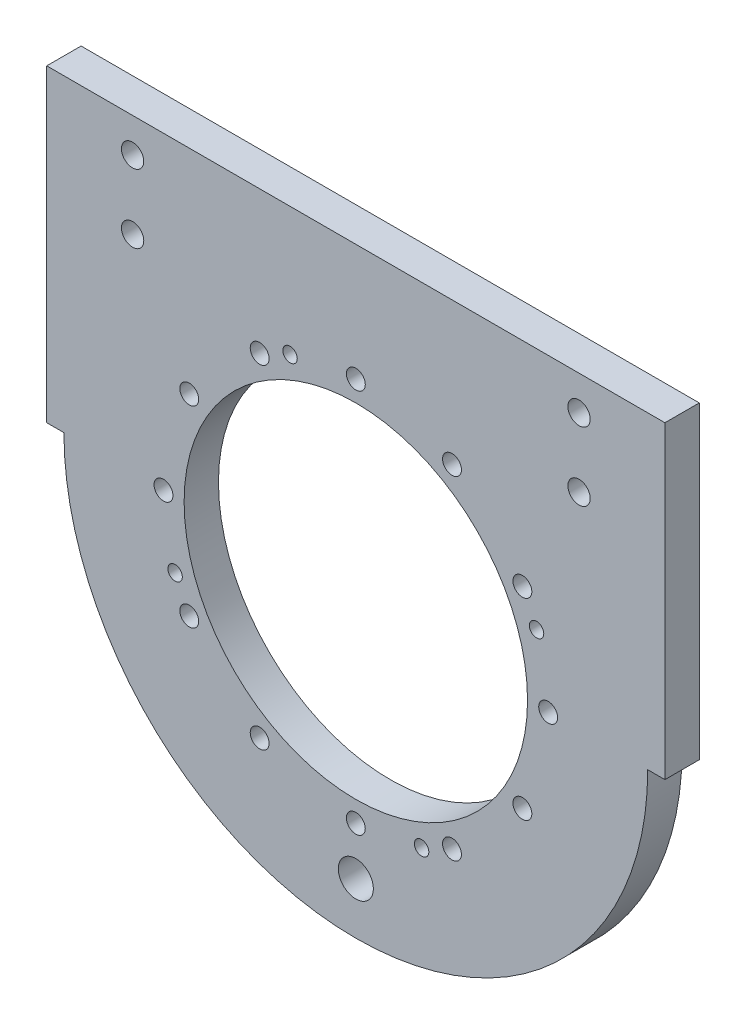
ISO-10303-21;
HEADER;
FILE_DESCRIPTION(('STEP AP214'),'2;1');
FILE_NAME('part.step','',(''),(''),'','','');
FILE_SCHEMA(('AUTOMOTIVE_DESIGN { 1 0 10303 214 1 1 1 1 }'));
ENDSEC;
DATA;
#1=APPLICATION_CONTEXT('core data for automotive mechanical design processes');
#2=APPLICATION_PROTOCOL_DEFINITION('international standard','automotive_design',2000,#1);
#3=PRODUCT_CONTEXT('',#1,'mechanical');
#4=PRODUCT('Part','Part','',(#3));
#5=PRODUCT_RELATED_PRODUCT_CATEGORY('part','',(#4));
#6=PRODUCT_DEFINITION_FORMATION('','',#4);
#7=PRODUCT_DEFINITION_CONTEXT('part definition',#1,'design');
#8=PRODUCT_DEFINITION('design','',#6,#7);
#9=PRODUCT_DEFINITION_SHAPE('','',#8);
#10=(LENGTH_UNIT() NAMED_UNIT(*) SI_UNIT(.MILLI.,.METRE.));
#11=(NAMED_UNIT(*) PLANE_ANGLE_UNIT() SI_UNIT($,.RADIAN.));
#12=(NAMED_UNIT(*) SI_UNIT($,.STERADIAN.) SOLID_ANGLE_UNIT());
#13=UNCERTAINTY_MEASURE_WITH_UNIT(LENGTH_MEASURE(1.E-05),#10,'distance_accuracy_value','');
#14=(GEOMETRIC_REPRESENTATION_CONTEXT(3) GLOBAL_UNCERTAINTY_ASSIGNED_CONTEXT((#13)) GLOBAL_UNIT_ASSIGNED_CONTEXT((#10,
#11,#12)) REPRESENTATION_CONTEXT('',''));
#15=CARTESIAN_POINT('',(0.,0.,0.));
#16=DIRECTION('',(0.,0.,1.));
#17=DIRECTION('',(1.,0.,0.));
#18=AXIS2_PLACEMENT_3D('',#15,#16,#17);
#19=CARTESIAN_POINT('',(0.,0.,10.));
#20=DIRECTION('',(0.,0.,-1.));
#21=DIRECTION('',(-1.,0.,0.));
#22=AXIS2_PLACEMENT_3D('',#19,#20,#21);
#23=CYLINDRICAL_SURFACE('',#22,85.);
#24=DIRECTION('',(0.,0.,-1.));
#25=VECTOR('',#24,1.);
#26=CARTESIAN_POINT('',(85.,0.,10.));
#27=LINE('',#26,#25);
#28=CARTESIAN_POINT('',(85.,0.,10.));
#29=VERTEX_POINT('',#28);
#30=CARTESIAN_POINT('',(85.,0.,0.));
#31=VERTEX_POINT('',#30);
#32=EDGE_CURVE('E65',#29,#31,#27,.T.);
#33=ORIENTED_EDGE('',*,*,#32,.F.);
#34=CARTESIAN_POINT('',(0.,0.,10.));
#35=DIRECTION('',(0.,0.,1.));
#36=DIRECTION('',(1.,0.,0.));
#37=AXIS2_PLACEMENT_3D('',#34,#35,#36);
#38=CIRCLE('',#37,85.);
#39=CARTESIAN_POINT('',(-85.,0.,10.));
#40=VERTEX_POINT('',#39);
#41=EDGE_CURVE('E11',#40,#29,#38,.T.);
#42=ORIENTED_EDGE('',*,*,#41,.F.);
#43=DIRECTION('',(0.,0.,-1.));
#44=VECTOR('',#43,1.);
#45=CARTESIAN_POINT('',(-85.,0.,10.));
#46=LINE('',#45,#44);
#47=CARTESIAN_POINT('',(-85.,0.,0.));
#48=VERTEX_POINT('',#47);
#49=EDGE_CURVE('E104',#48,#40,#46,.F.);
#50=ORIENTED_EDGE('',*,*,#49,.F.);
#51=CARTESIAN_POINT('',(0.,0.,0.));
#52=DIRECTION('',(0.,0.,1.));
#53=DIRECTION('',(1.,0.,0.));
#54=AXIS2_PLACEMENT_3D('',#51,#52,#53);
#55=CIRCLE('',#54,85.);
#56=EDGE_CURVE('E50',#48,#31,#55,.T.);
#57=ORIENTED_EDGE('',*,*,#56,.T.);
#58=EDGE_LOOP('',(#33,#42,#50,#57));
#59=FACE_BOUND('',#58,.T.);
#60=ADVANCED_FACE('F47',(#59),#23,.T.);
#61=CARTESIAN_POINT('',(0.,0.,10.));
#62=DIRECTION('',(0.,0.,1.));
#63=DIRECTION('',(1.,0.,0.));
#64=AXIS2_PLACEMENT_3D('',#61,#62,#63);
#65=PLANE('',#64);
#66=CARTESIAN_POINT('',(-28.,-48.4974226119286,10.));
#67=DIRECTION('',(0.,0.,1.));
#68=DIRECTION('',(1.,0.,0.));
#69=AXIS2_PLACEMENT_3D('',#66,#67,#68);
#70=CIRCLE('',#69,2.75);
#71=CARTESIAN_POINT('',(-25.25,-48.4974226119286,10.));
#72=VERTEX_POINT('',#71);
#73=EDGE_CURVE('E152',#72,#72,#70,.T.);
#74=ORIENTED_EDGE('',*,*,#73,.F.);
#75=EDGE_LOOP('',(#74));
#76=FACE_BOUND('',#75,.T.);
#77=CARTESIAN_POINT('',(0.,-56.,10.));
#78=DIRECTION('',(0.,0.,1.));
#79=DIRECTION('',(1.,0.,0.));
#80=AXIS2_PLACEMENT_3D('',#77,#78,#79);
#81=CIRCLE('',#80,2.75);
#82=CARTESIAN_POINT('',(2.74999999999999,-56.,10.));
#83=VERTEX_POINT('',#82);
#84=EDGE_CURVE('E179',#83,#83,#81,.T.);
#85=ORIENTED_EDGE('',*,*,#84,.F.);
#86=EDGE_LOOP('',(#85));
#87=FACE_BOUND('',#86,.T.);
#88=CARTESIAN_POINT('',(28.,-48.4974226119286,10.));
#89=DIRECTION('',(0.,0.,1.));
#90=DIRECTION('',(1.,0.,0.));
#91=AXIS2_PLACEMENT_3D('',#88,#89,#90);
#92=CIRCLE('',#91,2.75);
#93=CARTESIAN_POINT('',(30.75,-48.4974226119286,10.));
#94=VERTEX_POINT('',#93);
#95=EDGE_CURVE('E183',#94,#94,#92,.T.);
#96=ORIENTED_EDGE('',*,*,#95,.F.);
#97=EDGE_LOOP('',(#96));
#98=FACE_BOUND('',#97,.T.);
#99=CARTESIAN_POINT('',(48.4974226119285,-28.,10.));
#100=DIRECTION('',(0.,0.,1.));
#101=DIRECTION('',(1.,0.,0.));
#102=AXIS2_PLACEMENT_3D('',#99,#100,#101);
#103=CIRCLE('',#102,2.75);
#104=CARTESIAN_POINT('',(51.2474226119285,-28.,10.));
#105=VERTEX_POINT('',#104);
#106=EDGE_CURVE('E187',#105,#105,#103,.T.);
#107=ORIENTED_EDGE('',*,*,#106,.F.);
#108=EDGE_LOOP('',(#107));
#109=FACE_BOUND('',#108,.T.);
#110=CARTESIAN_POINT('',(52.6227867640109,19.1531280262374,10.));
#111=DIRECTION('',(0.,0.,1.));
#112=DIRECTION('',(1.,0.,0.));
#113=AXIS2_PLACEMENT_3D('',#110,#111,#112);
#114=CIRCLE('',#113,2.1);
#115=CARTESIAN_POINT('',(54.7227867640109,19.1531280262374,10.));
#116=VERTEX_POINT('',#115);
#117=EDGE_CURVE('E191',#116,#116,#114,.T.);
#118=ORIENTED_EDGE('',*,*,#117,.F.);
#119=EDGE_LOOP('',(#118));
#120=FACE_BOUND('',#119,.T.);
#121=CARTESIAN_POINT('',(-19.1531280262374,52.6227867640109,10.));
#122=DIRECTION('',(0.,0.,1.));
#123=DIRECTION('',(1.,0.,0.));
#124=AXIS2_PLACEMENT_3D('',#121,#122,#123);
#125=CIRCLE('',#124,2.1);
#126=CARTESIAN_POINT('',(-17.0531280262374,52.6227867640109,10.));
#127=VERTEX_POINT('',#126);
#128=EDGE_CURVE('E195',#127,#127,#125,.T.);
#129=ORIENTED_EDGE('',*,*,#128,.F.);
#130=EDGE_LOOP('',(#129));
#131=FACE_BOUND('',#130,.T.);
#132=CARTESIAN_POINT('',(-52.6227867640109,-19.1531280262374,10.));
#133=DIRECTION('',(0.,0.,1.));
#134=DIRECTION('',(1.,0.,0.));
#135=AXIS2_PLACEMENT_3D('',#132,#133,#134);
#136=CIRCLE('',#135,2.1);
#137=CARTESIAN_POINT('',(-50.5227867640109,-19.1531280262374,10.));
#138=VERTEX_POINT('',#137);
#139=EDGE_CURVE('E199',#138,#138,#136,.T.);
#140=ORIENTED_EDGE('',*,*,#139,.F.);
#141=EDGE_LOOP('',(#140));
#142=FACE_BOUND('',#141,.T.);
#143=CARTESIAN_POINT('',(19.1531280262375,-52.6227867640109,10.));
#144=DIRECTION('',(0.,0.,1.));
#145=DIRECTION('',(1.,0.,0.));
#146=AXIS2_PLACEMENT_3D('',#143,#144,#145);
#147=CIRCLE('',#146,2.1);
#148=CARTESIAN_POINT('',(21.2531280262375,-52.6227867640109,10.));
#149=VERTEX_POINT('',#148);
#150=EDGE_CURVE('E203',#149,#149,#147,.T.);
#151=ORIENTED_EDGE('',*,*,#150,.F.);
#152=EDGE_LOOP('',(#151));
#153=FACE_BOUND('',#152,.T.);
#154=CARTESIAN_POINT('',(-48.4974226119286,-28.,10.));
#155=DIRECTION('',(0.,0.,1.));
#156=DIRECTION('',(1.,0.,0.));
#157=AXIS2_PLACEMENT_3D('',#154,#155,#156);
#158=CIRCLE('',#157,2.75);
#159=CARTESIAN_POINT('',(-45.7474226119286,-28.,10.));
#160=VERTEX_POINT('',#159);
#161=EDGE_CURVE('E207',#160,#160,#158,.T.);
#162=ORIENTED_EDGE('',*,*,#161,.F.);
#163=EDGE_LOOP('',(#162));
#164=FACE_BOUND('',#163,.T.);
#165=CARTESIAN_POINT('',(-56.,0.,10.));
#166=DIRECTION('',(0.,0.,1.));
#167=DIRECTION('',(1.,0.,0.));
#168=AXIS2_PLACEMENT_3D('',#165,#166,#167);
#169=CIRCLE('',#168,2.75);
#170=CARTESIAN_POINT('',(-53.25,0.,10.));
#171=VERTEX_POINT('',#170);
#172=EDGE_CURVE('E211',#171,#171,#169,.T.);
#173=ORIENTED_EDGE('',*,*,#172,.F.);
#174=EDGE_LOOP('',(#173));
#175=FACE_BOUND('',#174,.T.);
#176=CARTESIAN_POINT('',(-48.4974226119286,28.,10.));
#177=DIRECTION('',(0.,0.,1.));
#178=DIRECTION('',(1.,0.,0.));
#179=AXIS2_PLACEMENT_3D('',#176,#177,#178);
#180=CIRCLE('',#179,2.75);
#181=CARTESIAN_POINT('',(-45.7474226119286,28.,10.));
#182=VERTEX_POINT('',#181);
#183=EDGE_CURVE('E215',#182,#182,#180,.T.);
#184=ORIENTED_EDGE('',*,*,#183,.F.);
#185=EDGE_LOOP('',(#184));
#186=FACE_BOUND('',#185,.T.);
#187=CARTESIAN_POINT('',(-28.,48.4974226119286,10.));
#188=DIRECTION('',(0.,0.,1.));
#189=DIRECTION('',(1.,0.,0.));
#190=AXIS2_PLACEMENT_3D('',#187,#188,#189);
#191=CIRCLE('',#190,2.75);
#192=CARTESIAN_POINT('',(-25.25,48.4974226119286,10.));
#193=VERTEX_POINT('',#192);
#194=EDGE_CURVE('E219',#193,#193,#191,.T.);
#195=ORIENTED_EDGE('',*,*,#194,.F.);
#196=EDGE_LOOP('',(#195));
#197=FACE_BOUND('',#196,.T.);
#198=CARTESIAN_POINT('',(0.,56.,10.));
#199=DIRECTION('',(0.,0.,1.));
#200=DIRECTION('',(1.,0.,0.));
#201=AXIS2_PLACEMENT_3D('',#198,#199,#200);
#202=CIRCLE('',#201,2.75);
#203=CARTESIAN_POINT('',(2.75,56.,10.));
#204=VERTEX_POINT('',#203);
#205=EDGE_CURVE('E223',#204,#204,#202,.T.);
#206=ORIENTED_EDGE('',*,*,#205,.F.);
#207=EDGE_LOOP('',(#206));
#208=FACE_BOUND('',#207,.T.);
#209=CARTESIAN_POINT('',(28.,48.4974226119286,10.));
#210=DIRECTION('',(0.,0.,1.));
#211=DIRECTION('',(1.,0.,0.));
#212=AXIS2_PLACEMENT_3D('',#209,#210,#211);
#213=CIRCLE('',#212,2.75);
#214=CARTESIAN_POINT('',(30.75,48.4974226119286,10.));
#215=VERTEX_POINT('',#214);
#216=EDGE_CURVE('E227',#215,#215,#213,.T.);
#217=ORIENTED_EDGE('',*,*,#216,.F.);
#218=EDGE_LOOP('',(#217));
#219=FACE_BOUND('',#218,.T.);
#220=CARTESIAN_POINT('',(48.4974226119286,28.,10.));
#221=DIRECTION('',(0.,0.,1.));
#222=DIRECTION('',(1.,0.,0.));
#223=AXIS2_PLACEMENT_3D('',#220,#221,#222);
#224=CIRCLE('',#223,2.75);
#225=CARTESIAN_POINT('',(51.2474226119286,28.,10.));
#226=VERTEX_POINT('',#225);
#227=EDGE_CURVE('E231',#226,#226,#224,.T.);
#228=ORIENTED_EDGE('',*,*,#227,.F.);
#229=EDGE_LOOP('',(#228));
#230=FACE_BOUND('',#229,.T.);
#231=CARTESIAN_POINT('',(56.,0.,10.));
#232=DIRECTION('',(0.,0.,1.));
#233=DIRECTION('',(1.,0.,0.));
#234=AXIS2_PLACEMENT_3D('',#231,#232,#233);
#235=CIRCLE('',#234,2.75);
#236=CARTESIAN_POINT('',(58.75,0.,10.));
#237=VERTEX_POINT('',#236);
#238=EDGE_CURVE('E235',#237,#237,#235,.T.);
#239=ORIENTED_EDGE('',*,*,#238,.F.);
#240=EDGE_LOOP('',(#239));
#241=FACE_BOUND('',#240,.T.);
#242=CARTESIAN_POINT('',(65.,80.,10.));
#243=DIRECTION('',(0.,0.,1.));
#244=DIRECTION('',(1.,0.,0.));
#245=AXIS2_PLACEMENT_3D('',#242,#243,#244);
#246=CIRCLE('',#245,3.25);
#247=CARTESIAN_POINT('',(68.25,80.,10.));
#248=VERTEX_POINT('',#247);
#249=EDGE_CURVE('E239',#248,#248,#246,.T.);
#250=ORIENTED_EDGE('',*,*,#249,.F.);
#251=EDGE_LOOP('',(#250));
#252=FACE_BOUND('',#251,.T.);
#253=CARTESIAN_POINT('',(0.,-70.,10.));
#254=DIRECTION('',(0.,0.,1.));
#255=DIRECTION('',(1.,0.,0.));
#256=AXIS2_PLACEMENT_3D('',#253,#254,#255);
#257=CIRCLE('',#256,5.1);
#258=CARTESIAN_POINT('',(5.1,-70.,10.));
#259=VERTEX_POINT('',#258);
#260=EDGE_CURVE('E243',#259,#259,#257,.T.);
#261=ORIENTED_EDGE('',*,*,#260,.F.);
#262=EDGE_LOOP('',(#261));
#263=FACE_BOUND('',#262,.T.);
#264=CARTESIAN_POINT('',(-65.,60.,10.));
#265=DIRECTION('',(0.,0.,1.));
#266=DIRECTION('',(1.,0.,0.));
#267=AXIS2_PLACEMENT_3D('',#264,#265,#266);
#268=CIRCLE('',#267,3.25);
#269=CARTESIAN_POINT('',(-61.75,60.,10.));
#270=VERTEX_POINT('',#269);
#271=EDGE_CURVE('E247',#270,#270,#268,.T.);
#272=ORIENTED_EDGE('',*,*,#271,.F.);
#273=EDGE_LOOP('',(#272));
#274=FACE_BOUND('',#273,.T.);
#275=CARTESIAN_POINT('',(-65.,80.,10.));
#276=DIRECTION('',(0.,0.,1.));
#277=DIRECTION('',(1.,0.,0.));
#278=AXIS2_PLACEMENT_3D('',#275,#276,#277);
#279=CIRCLE('',#278,3.25);
#280=CARTESIAN_POINT('',(-61.75,80.,10.));
#281=VERTEX_POINT('',#280);
#282=EDGE_CURVE('E251',#281,#281,#279,.T.);
#283=ORIENTED_EDGE('',*,*,#282,.F.);
#284=EDGE_LOOP('',(#283));
#285=FACE_BOUND('',#284,.T.);
#286=CARTESIAN_POINT('',(65.,60.,10.));
#287=DIRECTION('',(0.,0.,1.));
#288=DIRECTION('',(1.,0.,0.));
#289=AXIS2_PLACEMENT_3D('',#286,#287,#288);
#290=CIRCLE('',#289,3.25);
#291=CARTESIAN_POINT('',(68.25,60.,10.));
#292=VERTEX_POINT('',#291);
#293=EDGE_CURVE('E255',#292,#292,#290,.T.);
#294=ORIENTED_EDGE('',*,*,#293,.F.);
#295=EDGE_LOOP('',(#294));
#296=FACE_BOUND('',#295,.T.);
#297=CARTESIAN_POINT('',(0.,0.,10.));
#298=DIRECTION('',(0.,0.,1.));
#299=DIRECTION('',(1.,0.,0.));
#300=AXIS2_PLACEMENT_3D('',#297,#298,#299);
#301=CIRCLE('',#300,50.);
#302=CARTESIAN_POINT('',(50.,0.,10.));
#303=VERTEX_POINT('',#302);
#304=EDGE_CURVE('E259',#303,#303,#301,.T.);
#305=ORIENTED_EDGE('',*,*,#304,.F.);
#306=EDGE_LOOP('',(#305));
#307=FACE_BOUND('',#306,.T.);
#308=ORIENTED_EDGE('',*,*,#41,.T.);
#309=DIRECTION('',(1.,0.,0.));
#310=VECTOR('',#309,1.);
#311=CARTESIAN_POINT('',(-90.,0.,10.));
#312=LINE('',#311,#310);
#313=CARTESIAN_POINT('',(90.,0.,10.));
#314=VERTEX_POINT('',#313);
#315=EDGE_CURVE('E108',#29,#314,#312,.T.);
#316=ORIENTED_EDGE('',*,*,#315,.T.);
#317=DIRECTION('',(0.,1.,0.));
#318=VECTOR('',#317,1.);
#319=CARTESIAN_POINT('',(90.,0.,10.));
#320=LINE('',#319,#318);
#321=CARTESIAN_POINT('',(90.,90.,10.));
#322=VERTEX_POINT('',#321);
#323=EDGE_CURVE('E107',#314,#322,#320,.T.);
#324=ORIENTED_EDGE('',*,*,#323,.T.);
#325=DIRECTION('',(-1.,0.,0.));
#326=VECTOR('',#325,1.);
#327=CARTESIAN_POINT('',(90.,90.,10.));
#328=LINE('',#327,#326);
#329=CARTESIAN_POINT('',(-90.,90.,10.));
#330=VERTEX_POINT('',#329);
#331=EDGE_CURVE('E114',#322,#330,#328,.T.);
#332=ORIENTED_EDGE('',*,*,#331,.T.);
#333=DIRECTION('',(0.,-1.,0.));
#334=VECTOR('',#333,1.);
#335=CARTESIAN_POINT('',(-90.,90.,10.));
#336=LINE('',#335,#334);
#337=CARTESIAN_POINT('',(-90.,0.,10.));
#338=VERTEX_POINT('',#337);
#339=EDGE_CURVE('E111',#330,#338,#336,.T.);
#340=ORIENTED_EDGE('',*,*,#339,.T.);
#341=EDGE_CURVE('E97',#338,#40,#312,.T.);
#342=ORIENTED_EDGE('',*,*,#341,.T.);
#343=EDGE_LOOP('',(#308,#316,#324,#332,#340,#342));
#344=FACE_BOUND('',#343,.T.);
#345=ADVANCED_FACE('F112',(#76,#87,#98,#109,#120,#131,#142,#153,#164,#175,#186,#197,#208,#219,
#230,#241,#252,#263,#274,#285,#296,#307,#344),#65,.T.);
#346=CARTESIAN_POINT('',(0.,0.,0.));
#347=DIRECTION('',(0.,0.,1.));
#348=DIRECTION('',(1.,0.,0.));
#349=AXIS2_PLACEMENT_3D('',#346,#347,#348);
#350=PLANE('',#349);
#351=CARTESIAN_POINT('',(-28.,-48.4974226119286,0.));
#352=DIRECTION('',(0.,0.,-1.));
#353=DIRECTION('',(-1.,0.,0.));
#354=AXIS2_PLACEMENT_3D('',#351,#352,#353);
#355=CIRCLE('',#354,2.75);
#356=CARTESIAN_POINT('',(-30.75,-48.4974226119286,0.));
#357=VERTEX_POINT('',#356);
#358=EDGE_CURVE('E273',#357,#357,#355,.T.);
#359=ORIENTED_EDGE('',*,*,#358,.F.);
#360=EDGE_LOOP('',(#359));
#361=FACE_BOUND('',#360,.T.);
#362=CARTESIAN_POINT('',(0.,-56.,0.));
#363=DIRECTION('',(0.,0.,-1.));
#364=DIRECTION('',(-1.,0.,0.));
#365=AXIS2_PLACEMENT_3D('',#362,#363,#364);
#366=CIRCLE('',#365,2.75);
#367=CARTESIAN_POINT('',(-2.75000000000001,-56.,0.));
#368=VERTEX_POINT('',#367);
#369=EDGE_CURVE('E309',#368,#368,#366,.T.);
#370=ORIENTED_EDGE('',*,*,#369,.F.);
#371=EDGE_LOOP('',(#370));
#372=FACE_BOUND('',#371,.T.);
#373=CARTESIAN_POINT('',(28.,-48.4974226119286,0.));
#374=DIRECTION('',(0.,0.,-1.));
#375=DIRECTION('',(-1.,0.,0.));
#376=AXIS2_PLACEMENT_3D('',#373,#374,#375);
#377=CIRCLE('',#376,2.75);
#378=CARTESIAN_POINT('',(25.25,-48.4974226119286,0.));
#379=VERTEX_POINT('',#378);
#380=EDGE_CURVE('E304',#379,#379,#377,.T.);
#381=ORIENTED_EDGE('',*,*,#380,.F.);
#382=EDGE_LOOP('',(#381));
#383=FACE_BOUND('',#382,.T.);
#384=CARTESIAN_POINT('',(48.4974226119285,-28.,0.));
#385=DIRECTION('',(0.,0.,-1.));
#386=DIRECTION('',(-1.,0.,0.));
#387=AXIS2_PLACEMENT_3D('',#384,#385,#386);
#388=CIRCLE('',#387,2.75);
#389=CARTESIAN_POINT('',(45.7474226119285,-28.,0.));
#390=VERTEX_POINT('',#389);
#391=EDGE_CURVE('E300',#390,#390,#388,.T.);
#392=ORIENTED_EDGE('',*,*,#391,.F.);
#393=EDGE_LOOP('',(#392));
#394=FACE_BOUND('',#393,.T.);
#395=CARTESIAN_POINT('',(52.6227867640109,19.1531280262374,0.));
#396=DIRECTION('',(0.,0.,-1.));
#397=DIRECTION('',(-1.,0.,0.));
#398=AXIS2_PLACEMENT_3D('',#395,#396,#397);
#399=CIRCLE('',#398,2.1);
#400=CARTESIAN_POINT('',(50.5227867640109,19.1531280262374,0.));
#401=VERTEX_POINT('',#400);
#402=EDGE_CURVE('E305',#401,#401,#399,.T.);
#403=ORIENTED_EDGE('',*,*,#402,.F.);
#404=EDGE_LOOP('',(#403));
#405=FACE_BOUND('',#404,.T.);
#406=CARTESIAN_POINT('',(-19.1531280262374,52.6227867640109,0.));
#407=DIRECTION('',(0.,0.,-1.));
#408=DIRECTION('',(-1.,0.,0.));
#409=AXIS2_PLACEMENT_3D('',#406,#407,#408);
#410=CIRCLE('',#409,2.1);
#411=CARTESIAN_POINT('',(-21.2531280262374,52.6227867640109,0.));
#412=VERTEX_POINT('',#411);
#413=EDGE_CURVE('E325',#412,#412,#410,.T.);
#414=ORIENTED_EDGE('',*,*,#413,.F.);
#415=EDGE_LOOP('',(#414));
#416=FACE_BOUND('',#415,.T.);
#417=CARTESIAN_POINT('',(-52.6227867640109,-19.1531280262374,0.));
#418=DIRECTION('',(0.,0.,-1.));
#419=DIRECTION('',(-1.,0.,0.));
#420=AXIS2_PLACEMENT_3D('',#417,#418,#419);
#421=CIRCLE('',#420,2.1);
#422=CARTESIAN_POINT('',(-54.7227867640109,-19.1531280262374,0.));
#423=VERTEX_POINT('',#422);
#424=EDGE_CURVE('E320',#423,#423,#421,.T.);
#425=ORIENTED_EDGE('',*,*,#424,.F.);
#426=EDGE_LOOP('',(#425));
#427=FACE_BOUND('',#426,.T.);
#428=CARTESIAN_POINT('',(19.1531280262375,-52.6227867640109,0.));
#429=DIRECTION('',(0.,0.,-1.));
#430=DIRECTION('',(-1.,0.,0.));
#431=AXIS2_PLACEMENT_3D('',#428,#429,#430);
#432=CIRCLE('',#431,2.1);
#433=CARTESIAN_POINT('',(17.0531280262375,-52.6227867640109,0.));
#434=VERTEX_POINT('',#433);
#435=EDGE_CURVE('E316',#434,#434,#432,.T.);
#436=ORIENTED_EDGE('',*,*,#435,.F.);
#437=EDGE_LOOP('',(#436));
#438=FACE_BOUND('',#437,.T.);
#439=CARTESIAN_POINT('',(-48.4974226119286,-28.,0.));
#440=DIRECTION('',(0.,0.,-1.));
#441=DIRECTION('',(-1.,0.,0.));
#442=AXIS2_PLACEMENT_3D('',#439,#440,#441);
#443=CIRCLE('',#442,2.75);
#444=CARTESIAN_POINT('',(-51.2474226119286,-28.,0.));
#445=VERTEX_POINT('',#444);
#446=EDGE_CURVE('E268',#445,#445,#443,.T.);
#447=ORIENTED_EDGE('',*,*,#446,.F.);
#448=EDGE_LOOP('',(#447));
#449=FACE_BOUND('',#448,.T.);
#450=CARTESIAN_POINT('',(-56.,0.,0.));
#451=DIRECTION('',(0.,0.,-1.));
#452=DIRECTION('',(-1.,0.,0.));
#453=AXIS2_PLACEMENT_3D('',#450,#451,#452);
#454=CIRCLE('',#453,2.75);
#455=CARTESIAN_POINT('',(-58.75,0.,0.));
#456=VERTEX_POINT('',#455);
#457=EDGE_CURVE('E272',#456,#456,#454,.T.);
#458=ORIENTED_EDGE('',*,*,#457,.F.);
#459=EDGE_LOOP('',(#458));
#460=FACE_BOUND('',#459,.T.);
#461=CARTESIAN_POINT('',(-48.4974226119286,28.,0.));
#462=DIRECTION('',(0.,0.,-1.));
#463=DIRECTION('',(-1.,0.,0.));
#464=AXIS2_PLACEMENT_3D('',#461,#462,#463);
#465=CIRCLE('',#464,2.75);
#466=CARTESIAN_POINT('',(-51.2474226119286,28.,0.));
#467=VERTEX_POINT('',#466);
#468=EDGE_CURVE('E277',#467,#467,#465,.T.);
#469=ORIENTED_EDGE('',*,*,#468,.F.);
#470=EDGE_LOOP('',(#469));
#471=FACE_BOUND('',#470,.T.);
#472=CARTESIAN_POINT('',(-28.,48.4974226119286,0.));
#473=DIRECTION('',(0.,0.,-1.));
#474=DIRECTION('',(-1.,0.,0.));
#475=AXIS2_PLACEMENT_3D('',#472,#473,#474);
#476=CIRCLE('',#475,2.75);
#477=CARTESIAN_POINT('',(-30.75,48.4974226119286,0.));
#478=VERTEX_POINT('',#477);
#479=EDGE_CURVE('E281',#478,#478,#476,.T.);
#480=ORIENTED_EDGE('',*,*,#479,.F.);
#481=EDGE_LOOP('',(#480));
#482=FACE_BOUND('',#481,.T.);
#483=CARTESIAN_POINT('',(0.,56.,0.));
#484=DIRECTION('',(0.,0.,-1.));
#485=DIRECTION('',(-1.,0.,0.));
#486=AXIS2_PLACEMENT_3D('',#483,#484,#485);
#487=CIRCLE('',#486,2.75);
#488=CARTESIAN_POINT('',(-2.75,56.,0.));
#489=VERTEX_POINT('',#488);
#490=EDGE_CURVE('E285',#489,#489,#487,.T.);
#491=ORIENTED_EDGE('',*,*,#490,.F.);
#492=EDGE_LOOP('',(#491));
#493=FACE_BOUND('',#492,.T.);
#494=CARTESIAN_POINT('',(28.,48.4974226119286,0.));
#495=DIRECTION('',(0.,0.,-1.));
#496=DIRECTION('',(-1.,0.,0.));
#497=AXIS2_PLACEMENT_3D('',#494,#495,#496);
#498=CIRCLE('',#497,2.75);
#499=CARTESIAN_POINT('',(25.25,48.4974226119286,0.));
#500=VERTEX_POINT('',#499);
#501=EDGE_CURVE('E289',#500,#500,#498,.T.);
#502=ORIENTED_EDGE('',*,*,#501,.F.);
#503=EDGE_LOOP('',(#502));
#504=FACE_BOUND('',#503,.T.);
#505=CARTESIAN_POINT('',(48.4974226119286,28.,0.));
#506=DIRECTION('',(0.,0.,-1.));
#507=DIRECTION('',(-1.,0.,0.));
#508=AXIS2_PLACEMENT_3D('',#505,#506,#507);
#509=CIRCLE('',#508,2.75);
#510=CARTESIAN_POINT('',(45.7474226119286,28.,0.));
#511=VERTEX_POINT('',#510);
#512=EDGE_CURVE('E293',#511,#511,#509,.T.);
#513=ORIENTED_EDGE('',*,*,#512,.F.);
#514=EDGE_LOOP('',(#513));
#515=FACE_BOUND('',#514,.T.);
#516=CARTESIAN_POINT('',(56.,0.,0.));
#517=DIRECTION('',(0.,0.,-1.));
#518=DIRECTION('',(-1.,0.,0.));
#519=AXIS2_PLACEMENT_3D('',#516,#517,#518);
#520=CIRCLE('',#519,2.75);
#521=CARTESIAN_POINT('',(53.25,0.,0.));
#522=VERTEX_POINT('',#521);
#523=EDGE_CURVE('E267',#522,#522,#520,.T.);
#524=ORIENTED_EDGE('',*,*,#523,.F.);
#525=EDGE_LOOP('',(#524));
#526=FACE_BOUND('',#525,.T.);
#527=CARTESIAN_POINT('',(65.,80.,0.));
#528=DIRECTION('',(0.,0.,-1.));
#529=DIRECTION('',(-1.,0.,0.));
#530=AXIS2_PLACEMENT_3D('',#527,#528,#529);
#531=CIRCLE('',#530,3.25);
#532=CARTESIAN_POINT('',(61.75,80.,0.));
#533=VERTEX_POINT('',#532);
#534=EDGE_CURVE('E344',#533,#533,#531,.T.);
#535=ORIENTED_EDGE('',*,*,#534,.F.);
#536=EDGE_LOOP('',(#535));
#537=FACE_BOUND('',#536,.T.);
#538=CARTESIAN_POINT('',(0.,-70.,0.));
#539=DIRECTION('',(0.,0.,-1.));
#540=DIRECTION('',(-1.,0.,0.));
#541=AXIS2_PLACEMENT_3D('',#538,#539,#540);
#542=CIRCLE('',#541,5.1);
#543=CARTESIAN_POINT('',(-5.1,-70.,0.));
#544=VERTEX_POINT('',#543);
#545=EDGE_CURVE('E321',#544,#544,#542,.T.);
#546=ORIENTED_EDGE('',*,*,#545,.F.);
#547=EDGE_LOOP('',(#546));
#548=FACE_BOUND('',#547,.T.);
#549=CARTESIAN_POINT('',(-65.,60.,0.));
#550=DIRECTION('',(0.,0.,-1.));
#551=DIRECTION('',(-1.,0.,0.));
#552=AXIS2_PLACEMENT_3D('',#549,#550,#551);
#553=CIRCLE('',#552,3.25);
#554=CARTESIAN_POINT('',(-68.25,60.,0.));
#555=VERTEX_POINT('',#554);
#556=EDGE_CURVE('E332',#555,#555,#553,.T.);
#557=ORIENTED_EDGE('',*,*,#556,.F.);
#558=EDGE_LOOP('',(#557));
#559=FACE_BOUND('',#558,.T.);
#560=CARTESIAN_POINT('',(-65.,80.,0.));
#561=DIRECTION('',(0.,0.,-1.));
#562=DIRECTION('',(-1.,0.,0.));
#563=AXIS2_PLACEMENT_3D('',#560,#561,#562);
#564=CIRCLE('',#563,3.25);
#565=CARTESIAN_POINT('',(-68.25,80.,0.));
#566=VERTEX_POINT('',#565);
#567=EDGE_CURVE('E336',#566,#566,#564,.T.);
#568=ORIENTED_EDGE('',*,*,#567,.F.);
#569=EDGE_LOOP('',(#568));
#570=FACE_BOUND('',#569,.T.);
#571=CARTESIAN_POINT('',(65.,60.,0.));
#572=DIRECTION('',(0.,0.,-1.));
#573=DIRECTION('',(-1.,0.,0.));
#574=AXIS2_PLACEMENT_3D('',#571,#572,#573);
#575=CIRCLE('',#574,3.25);
#576=CARTESIAN_POINT('',(61.75,60.,0.));
#577=VERTEX_POINT('',#576);
#578=EDGE_CURVE('E340',#577,#577,#575,.T.);
#579=ORIENTED_EDGE('',*,*,#578,.F.);
#580=EDGE_LOOP('',(#579));
#581=FACE_BOUND('',#580,.T.);
#582=CARTESIAN_POINT('',(0.,0.,0.));
#583=DIRECTION('',(0.,0.,-1.));
#584=DIRECTION('',(-1.,0.,0.));
#585=AXIS2_PLACEMENT_3D('',#582,#583,#584);
#586=CIRCLE('',#585,50.);
#587=CARTESIAN_POINT('',(-50.,0.,0.));
#588=VERTEX_POINT('',#587);
#589=EDGE_CURVE('E263',#588,#588,#586,.T.);
#590=ORIENTED_EDGE('',*,*,#589,.F.);
#591=EDGE_LOOP('',(#590));
#592=FACE_BOUND('',#591,.T.);
#593=ORIENTED_EDGE('',*,*,#56,.F.);
#594=DIRECTION('',(1.,0.,0.));
#595=VECTOR('',#594,1.);
#596=CARTESIAN_POINT('',(-90.,0.,0.));
#597=LINE('',#596,#595);
#598=CARTESIAN_POINT('',(-90.,0.,0.));
#599=VERTEX_POINT('',#598);
#600=EDGE_CURVE('E142',#599,#48,#597,.T.);
#601=ORIENTED_EDGE('',*,*,#600,.F.);
#602=DIRECTION('',(0.,-1.,0.));
#603=VECTOR('',#602,1.);
#604=CARTESIAN_POINT('',(-90.,90.,0.));
#605=LINE('',#604,#603);
#606=CARTESIAN_POINT('',(-90.,90.,0.));
#607=VERTEX_POINT('',#606);
#608=EDGE_CURVE('E123',#607,#599,#605,.T.);
#609=ORIENTED_EDGE('',*,*,#608,.F.);
#610=DIRECTION('',(-1.,0.,0.));
#611=VECTOR('',#610,1.);
#612=CARTESIAN_POINT('',(90.,90.,0.));
#613=LINE('',#612,#611);
#614=CARTESIAN_POINT('',(90.,90.,0.));
#615=VERTEX_POINT('',#614);
#616=EDGE_CURVE('E119',#615,#607,#613,.T.);
#617=ORIENTED_EDGE('',*,*,#616,.F.);
#618=DIRECTION('',(0.,1.,0.));
#619=VECTOR('',#618,1.);
#620=CARTESIAN_POINT('',(90.,0.,0.));
#621=LINE('',#620,#619);
#622=CARTESIAN_POINT('',(90.,0.,0.));
#623=VERTEX_POINT('',#622);
#624=EDGE_CURVE('E146',#623,#615,#621,.T.);
#625=ORIENTED_EDGE('',*,*,#624,.F.);
#626=EDGE_CURVE('E144',#31,#623,#597,.T.);
#627=ORIENTED_EDGE('',*,*,#626,.F.);
#628=EDGE_LOOP('',(#593,#601,#609,#617,#625,#627));
#629=FACE_BOUND('',#628,.T.);
#630=ADVANCED_FACE('F141',(#361,#372,#383,#394,#405,#416,#427,#438,#449,#460,#471,#482,#493,
#504,#515,#526,#537,#548,#559,#570,#581,#592,#629),#350,.F.);
#631=CARTESIAN_POINT('',(-90.,0.,10.));
#632=DIRECTION('',(0.,1.,0.));
#633=DIRECTION('',(0.,0.,1.));
#634=AXIS2_PLACEMENT_3D('',#631,#632,#633);
#635=PLANE('',#634);
#636=ORIENTED_EDGE('',*,*,#315,.F.);
#637=ORIENTED_EDGE('',*,*,#32,.T.);
#638=ORIENTED_EDGE('',*,*,#626,.T.);
#639=DIRECTION('',(0.,0.,-1.));
#640=VECTOR('',#639,1.);
#641=CARTESIAN_POINT('',(90.,0.,10.));
#642=LINE('',#641,#640);
#643=EDGE_CURVE('E125',#314,#623,#642,.T.);
#644=ORIENTED_EDGE('',*,*,#643,.F.);
#645=EDGE_LOOP('',(#636,#637,#638,#644));
#646=FACE_BOUND('',#645,.T.);
#647=ADVANCED_FACE('F170',(#646),#635,.F.);
#648=ORIENTED_EDGE('',*,*,#600,.T.);
#649=ORIENTED_EDGE('',*,*,#49,.T.);
#650=ORIENTED_EDGE('',*,*,#341,.F.);
#651=DIRECTION('',(0.,0.,-1.));
#652=VECTOR('',#651,1.);
#653=CARTESIAN_POINT('',(-90.,0.,10.));
#654=LINE('',#653,#652);
#655=EDGE_CURVE('E102',#338,#599,#654,.T.);
#656=ORIENTED_EDGE('',*,*,#655,.T.);
#657=EDGE_LOOP('',(#648,#649,#650,#656));
#658=FACE_BOUND('',#657,.T.);
#659=ADVANCED_FACE('F100',(#658),#635,.F.);
#660=CARTESIAN_POINT('',(-90.,90.,10.));
#661=DIRECTION('',(1.,0.,0.));
#662=DIRECTION('',(0.,0.,-1.));
#663=AXIS2_PLACEMENT_3D('',#660,#661,#662);
#664=PLANE('',#663);
#665=ORIENTED_EDGE('',*,*,#608,.T.);
#666=ORIENTED_EDGE('',*,*,#655,.F.);
#667=ORIENTED_EDGE('',*,*,#339,.F.);
#668=DIRECTION('',(0.,0.,-1.));
#669=VECTOR('',#668,1.);
#670=CARTESIAN_POINT('',(-90.,90.,10.));
#671=LINE('',#670,#669);
#672=EDGE_CURVE('E160',#330,#607,#671,.T.);
#673=ORIENTED_EDGE('',*,*,#672,.T.);
#674=EDGE_LOOP('',(#665,#666,#667,#673));
#675=FACE_BOUND('',#674,.T.);
#676=ADVANCED_FACE('F121',(#675),#664,.F.);
#677=CARTESIAN_POINT('',(90.,0.,10.));
#678=DIRECTION('',(-1.,0.,0.));
#679=DIRECTION('',(0.,0.,1.));
#680=AXIS2_PLACEMENT_3D('',#677,#678,#679);
#681=PLANE('',#680);
#682=ORIENTED_EDGE('',*,*,#624,.T.);
#683=DIRECTION('',(0.,0.,-1.));
#684=VECTOR('',#683,1.);
#685=CARTESIAN_POINT('',(90.,90.,10.));
#686=LINE('',#685,#684);
#687=EDGE_CURVE('E131',#322,#615,#686,.T.);
#688=ORIENTED_EDGE('',*,*,#687,.F.);
#689=ORIENTED_EDGE('',*,*,#323,.F.);
#690=ORIENTED_EDGE('',*,*,#643,.T.);
#691=EDGE_LOOP('',(#682,#688,#689,#690));
#692=FACE_BOUND('',#691,.T.);
#693=ADVANCED_FACE('F169',(#692),#681,.F.);
#694=CARTESIAN_POINT('',(90.,90.,10.));
#695=DIRECTION('',(0.,-1.,0.));
#696=DIRECTION('',(0.,0.,-1.));
#697=AXIS2_PLACEMENT_3D('',#694,#695,#696);
#698=PLANE('',#697);
#699=ORIENTED_EDGE('',*,*,#616,.T.);
#700=ORIENTED_EDGE('',*,*,#672,.F.);
#701=ORIENTED_EDGE('',*,*,#331,.F.);
#702=ORIENTED_EDGE('',*,*,#687,.T.);
#703=EDGE_LOOP('',(#699,#700,#701,#702));
#704=FACE_BOUND('',#703,.T.);
#705=ADVANCED_FACE('F166',(#704),#698,.F.);
#706=CARTESIAN_POINT('',(0.,0.,11.));
#707=DIRECTION('',(0.,0.,-1.));
#708=DIRECTION('',(-1.,0.,0.));
#709=AXIS2_PLACEMENT_3D('',#706,#707,#708);
#710=CYLINDRICAL_SURFACE('',#709,50.);
#711=ORIENTED_EDGE('',*,*,#304,.T.);
#712=EDGE_LOOP('',(#711));
#713=FACE_BOUND('',#712,.T.);
#714=ORIENTED_EDGE('',*,*,#589,.T.);
#715=EDGE_LOOP('',(#714));
#716=FACE_BOUND('',#715,.T.);
#717=ADVANCED_FACE('F367',(#713,#716),#710,.F.);
#718=CARTESIAN_POINT('',(65.,60.,11.));
#719=DIRECTION('',(0.,0.,-1.));
#720=DIRECTION('',(-1.,0.,0.));
#721=AXIS2_PLACEMENT_3D('',#718,#719,#720);
#722=CYLINDRICAL_SURFACE('',#721,3.25);
#723=ORIENTED_EDGE('',*,*,#293,.T.);
#724=EDGE_LOOP('',(#723));
#725=FACE_BOUND('',#724,.T.);
#726=ORIENTED_EDGE('',*,*,#578,.T.);
#727=EDGE_LOOP('',(#726));
#728=FACE_BOUND('',#727,.T.);
#729=ADVANCED_FACE('F369',(#725,#728),#722,.F.);
#730=CARTESIAN_POINT('',(-65.,80.,11.));
#731=DIRECTION('',(0.,0.,-1.));
#732=DIRECTION('',(-1.,0.,0.));
#733=AXIS2_PLACEMENT_3D('',#730,#731,#732);
#734=CYLINDRICAL_SURFACE('',#733,3.25);
#735=ORIENTED_EDGE('',*,*,#282,.T.);
#736=EDGE_LOOP('',(#735));
#737=FACE_BOUND('',#736,.T.);
#738=ORIENTED_EDGE('',*,*,#567,.T.);
#739=EDGE_LOOP('',(#738));
#740=FACE_BOUND('',#739,.T.);
#741=ADVANCED_FACE('F375',(#737,#740),#734,.F.);
#742=CARTESIAN_POINT('',(-65.,60.,11.));
#743=DIRECTION('',(0.,0.,-1.));
#744=DIRECTION('',(-1.,0.,0.));
#745=AXIS2_PLACEMENT_3D('',#742,#743,#744);
#746=CYLINDRICAL_SURFACE('',#745,3.25);
#747=ORIENTED_EDGE('',*,*,#271,.T.);
#748=EDGE_LOOP('',(#747));
#749=FACE_BOUND('',#748,.T.);
#750=ORIENTED_EDGE('',*,*,#556,.T.);
#751=EDGE_LOOP('',(#750));
#752=FACE_BOUND('',#751,.T.);
#753=ADVANCED_FACE('F427',(#749,#752),#746,.F.);
#754=CARTESIAN_POINT('',(0.,-70.,11.));
#755=DIRECTION('',(0.,0.,-1.));
#756=DIRECTION('',(-1.,0.,0.));
#757=AXIS2_PLACEMENT_3D('',#754,#755,#756);
#758=CYLINDRICAL_SURFACE('',#757,5.1);
#759=ORIENTED_EDGE('',*,*,#260,.T.);
#760=EDGE_LOOP('',(#759));
#761=FACE_BOUND('',#760,.T.);
#762=ORIENTED_EDGE('',*,*,#545,.T.);
#763=EDGE_LOOP('',(#762));
#764=FACE_BOUND('',#763,.T.);
#765=ADVANCED_FACE('F437',(#761,#764),#758,.F.);
#766=CARTESIAN_POINT('',(65.,80.,11.));
#767=DIRECTION('',(0.,0.,-1.));
#768=DIRECTION('',(-1.,0.,0.));
#769=AXIS2_PLACEMENT_3D('',#766,#767,#768);
#770=CYLINDRICAL_SURFACE('',#769,3.25);
#771=ORIENTED_EDGE('',*,*,#249,.T.);
#772=EDGE_LOOP('',(#771));
#773=FACE_BOUND('',#772,.T.);
#774=ORIENTED_EDGE('',*,*,#534,.T.);
#775=EDGE_LOOP('',(#774));
#776=FACE_BOUND('',#775,.T.);
#777=ADVANCED_FACE('F352',(#773,#776),#770,.F.);
#778=CARTESIAN_POINT('',(56.,0.,11.));
#779=DIRECTION('',(0.,0.,-1.));
#780=DIRECTION('',(-1.,0.,0.));
#781=AXIS2_PLACEMENT_3D('',#778,#779,#780);
#782=CYLINDRICAL_SURFACE('',#781,2.75);
#783=ORIENTED_EDGE('',*,*,#238,.T.);
#784=EDGE_LOOP('',(#783));
#785=FACE_BOUND('',#784,.T.);
#786=ORIENTED_EDGE('',*,*,#523,.T.);
#787=EDGE_LOOP('',(#786));
#788=FACE_BOUND('',#787,.T.);
#789=ADVANCED_FACE('F456',(#785,#788),#782,.F.);
#790=CARTESIAN_POINT('',(48.4974226119286,28.,11.));
#791=DIRECTION('',(0.,0.,-1.));
#792=DIRECTION('',(-1.,0.,0.));
#793=AXIS2_PLACEMENT_3D('',#790,#791,#792);
#794=CYLINDRICAL_SURFACE('',#793,2.75);
#795=ORIENTED_EDGE('',*,*,#227,.T.);
#796=EDGE_LOOP('',(#795));
#797=FACE_BOUND('',#796,.T.);
#798=ORIENTED_EDGE('',*,*,#512,.T.);
#799=EDGE_LOOP('',(#798));
#800=FACE_BOUND('',#799,.T.);
#801=ADVANCED_FACE('F466',(#797,#800),#794,.F.);
#802=CARTESIAN_POINT('',(28.,48.4974226119286,11.));
#803=DIRECTION('',(0.,0.,-1.));
#804=DIRECTION('',(-1.,0.,0.));
#805=AXIS2_PLACEMENT_3D('',#802,#803,#804);
#806=CYLINDRICAL_SURFACE('',#805,2.75);
#807=ORIENTED_EDGE('',*,*,#216,.T.);
#808=EDGE_LOOP('',(#807));
#809=FACE_BOUND('',#808,.T.);
#810=ORIENTED_EDGE('',*,*,#501,.T.);
#811=EDGE_LOOP('',(#810));
#812=FACE_BOUND('',#811,.T.);
#813=ADVANCED_FACE('F476',(#809,#812),#806,.F.);
#814=CARTESIAN_POINT('',(0.,56.,11.));
#815=DIRECTION('',(0.,0.,-1.));
#816=DIRECTION('',(-1.,0.,0.));
#817=AXIS2_PLACEMENT_3D('',#814,#815,#816);
#818=CYLINDRICAL_SURFACE('',#817,2.75);
#819=ORIENTED_EDGE('',*,*,#205,.T.);
#820=EDGE_LOOP('',(#819));
#821=FACE_BOUND('',#820,.T.);
#822=ORIENTED_EDGE('',*,*,#490,.T.);
#823=EDGE_LOOP('',(#822));
#824=FACE_BOUND('',#823,.T.);
#825=ADVANCED_FACE('F486',(#821,#824),#818,.F.);
#826=CARTESIAN_POINT('',(-28.,48.4974226119286,11.));
#827=DIRECTION('',(0.,0.,-1.));
#828=DIRECTION('',(-1.,0.,0.));
#829=AXIS2_PLACEMENT_3D('',#826,#827,#828);
#830=CYLINDRICAL_SURFACE('',#829,2.75);
#831=ORIENTED_EDGE('',*,*,#194,.T.);
#832=EDGE_LOOP('',(#831));
#833=FACE_BOUND('',#832,.T.);
#834=ORIENTED_EDGE('',*,*,#479,.T.);
#835=EDGE_LOOP('',(#834));
#836=FACE_BOUND('',#835,.T.);
#837=ADVANCED_FACE('F496',(#833,#836),#830,.F.);
#838=CARTESIAN_POINT('',(-48.4974226119286,28.,11.));
#839=DIRECTION('',(0.,0.,-1.));
#840=DIRECTION('',(-1.,0.,0.));
#841=AXIS2_PLACEMENT_3D('',#838,#839,#840);
#842=CYLINDRICAL_SURFACE('',#841,2.75);
#843=ORIENTED_EDGE('',*,*,#183,.T.);
#844=EDGE_LOOP('',(#843));
#845=FACE_BOUND('',#844,.T.);
#846=ORIENTED_EDGE('',*,*,#468,.T.);
#847=EDGE_LOOP('',(#846));
#848=FACE_BOUND('',#847,.T.);
#849=ADVANCED_FACE('F506',(#845,#848),#842,.F.);
#850=CARTESIAN_POINT('',(-56.,0.,11.));
#851=DIRECTION('',(0.,0.,-1.));
#852=DIRECTION('',(-1.,0.,0.));
#853=AXIS2_PLACEMENT_3D('',#850,#851,#852);
#854=CYLINDRICAL_SURFACE('',#853,2.75);
#855=ORIENTED_EDGE('',*,*,#172,.T.);
#856=EDGE_LOOP('',(#855));
#857=FACE_BOUND('',#856,.T.);
#858=ORIENTED_EDGE('',*,*,#457,.T.);
#859=EDGE_LOOP('',(#858));
#860=FACE_BOUND('',#859,.T.);
#861=ADVANCED_FACE('F516',(#857,#860),#854,.F.);
#862=CARTESIAN_POINT('',(-48.4974226119286,-28.,11.));
#863=DIRECTION('',(0.,0.,-1.));
#864=DIRECTION('',(-1.,0.,0.));
#865=AXIS2_PLACEMENT_3D('',#862,#863,#864);
#866=CYLINDRICAL_SURFACE('',#865,2.75);
#867=ORIENTED_EDGE('',*,*,#161,.T.);
#868=EDGE_LOOP('',(#867));
#869=FACE_BOUND('',#868,.T.);
#870=ORIENTED_EDGE('',*,*,#446,.T.);
#871=EDGE_LOOP('',(#870));
#872=FACE_BOUND('',#871,.T.);
#873=ADVANCED_FACE('F526',(#869,#872),#866,.F.);
#874=CARTESIAN_POINT('',(19.1531280262375,-52.6227867640109,11.));
#875=DIRECTION('',(0.,0.,-1.));
#876=DIRECTION('',(-1.,0.,0.));
#877=AXIS2_PLACEMENT_3D('',#874,#875,#876);
#878=CYLINDRICAL_SURFACE('',#877,2.1);
#879=ORIENTED_EDGE('',*,*,#150,.T.);
#880=EDGE_LOOP('',(#879));
#881=FACE_BOUND('',#880,.T.);
#882=ORIENTED_EDGE('',*,*,#435,.T.);
#883=EDGE_LOOP('',(#882));
#884=FACE_BOUND('',#883,.T.);
#885=ADVANCED_FACE('F536',(#881,#884),#878,.F.);
#886=CARTESIAN_POINT('',(-52.6227867640109,-19.1531280262374,11.));
#887=DIRECTION('',(0.,0.,-1.));
#888=DIRECTION('',(-1.,0.,0.));
#889=AXIS2_PLACEMENT_3D('',#886,#887,#888);
#890=CYLINDRICAL_SURFACE('',#889,2.1);
#891=ORIENTED_EDGE('',*,*,#139,.T.);
#892=EDGE_LOOP('',(#891));
#893=FACE_BOUND('',#892,.T.);
#894=ORIENTED_EDGE('',*,*,#424,.T.);
#895=EDGE_LOOP('',(#894));
#896=FACE_BOUND('',#895,.T.);
#897=ADVANCED_FACE('F545',(#893,#896),#890,.F.);
#898=CARTESIAN_POINT('',(-19.1531280262374,52.6227867640109,11.));
#899=DIRECTION('',(0.,0.,-1.));
#900=DIRECTION('',(-1.,0.,0.));
#901=AXIS2_PLACEMENT_3D('',#898,#899,#900);
#902=CYLINDRICAL_SURFACE('',#901,2.1);
#903=ORIENTED_EDGE('',*,*,#128,.T.);
#904=EDGE_LOOP('',(#903));
#905=FACE_BOUND('',#904,.T.);
#906=ORIENTED_EDGE('',*,*,#413,.T.);
#907=EDGE_LOOP('',(#906));
#908=FACE_BOUND('',#907,.T.);
#909=ADVANCED_FACE('F555',(#905,#908),#902,.F.);
#910=CARTESIAN_POINT('',(52.6227867640109,19.1531280262374,11.));
#911=DIRECTION('',(0.,0.,-1.));
#912=DIRECTION('',(-1.,0.,0.));
#913=AXIS2_PLACEMENT_3D('',#910,#911,#912);
#914=CYLINDRICAL_SURFACE('',#913,2.1);
#915=ORIENTED_EDGE('',*,*,#117,.T.);
#916=EDGE_LOOP('',(#915));
#917=FACE_BOUND('',#916,.T.);
#918=ORIENTED_EDGE('',*,*,#402,.T.);
#919=EDGE_LOOP('',(#918));
#920=FACE_BOUND('',#919,.T.);
#921=ADVANCED_FACE('F565',(#917,#920),#914,.F.);
#922=CARTESIAN_POINT('',(48.4974226119285,-28.,11.));
#923=DIRECTION('',(0.,0.,-1.));
#924=DIRECTION('',(-1.,0.,0.));
#925=AXIS2_PLACEMENT_3D('',#922,#923,#924);
#926=CYLINDRICAL_SURFACE('',#925,2.75);
#927=ORIENTED_EDGE('',*,*,#106,.T.);
#928=EDGE_LOOP('',(#927));
#929=FACE_BOUND('',#928,.T.);
#930=ORIENTED_EDGE('',*,*,#391,.T.);
#931=EDGE_LOOP('',(#930));
#932=FACE_BOUND('',#931,.T.);
#933=ADVANCED_FACE('F575',(#929,#932),#926,.F.);
#934=CARTESIAN_POINT('',(28.,-48.4974226119286,11.));
#935=DIRECTION('',(0.,0.,-1.));
#936=DIRECTION('',(-1.,0.,0.));
#937=AXIS2_PLACEMENT_3D('',#934,#935,#936);
#938=CYLINDRICAL_SURFACE('',#937,2.75);
#939=ORIENTED_EDGE('',*,*,#95,.T.);
#940=EDGE_LOOP('',(#939));
#941=FACE_BOUND('',#940,.T.);
#942=ORIENTED_EDGE('',*,*,#380,.T.);
#943=EDGE_LOOP('',(#942));
#944=FACE_BOUND('',#943,.T.);
#945=ADVANCED_FACE('F585',(#941,#944),#938,.F.);
#946=CARTESIAN_POINT('',(0.,-56.,11.));
#947=DIRECTION('',(0.,0.,-1.));
#948=DIRECTION('',(-1.,0.,0.));
#949=AXIS2_PLACEMENT_3D('',#946,#947,#948);
#950=CYLINDRICAL_SURFACE('',#949,2.75);
#951=ORIENTED_EDGE('',*,*,#84,.T.);
#952=EDGE_LOOP('',(#951));
#953=FACE_BOUND('',#952,.T.);
#954=ORIENTED_EDGE('',*,*,#369,.T.);
#955=EDGE_LOOP('',(#954));
#956=FACE_BOUND('',#955,.T.);
#957=ADVANCED_FACE('F595',(#953,#956),#950,.F.);
#958=CARTESIAN_POINT('',(-28.,-48.4974226119286,11.));
#959=DIRECTION('',(0.,0.,-1.));
#960=DIRECTION('',(-1.,0.,0.));
#961=AXIS2_PLACEMENT_3D('',#958,#959,#960);
#962=CYLINDRICAL_SURFACE('',#961,2.75);
#963=ORIENTED_EDGE('',*,*,#73,.T.);
#964=EDGE_LOOP('',(#963));
#965=FACE_BOUND('',#964,.T.);
#966=ORIENTED_EDGE('',*,*,#358,.T.);
#967=EDGE_LOOP('',(#966));
#968=FACE_BOUND('',#967,.T.);
#969=ADVANCED_FACE('F605',(#965,#968),#962,.F.);
#970=CLOSED_SHELL('',(#60,#345,#630,#647,#659,#676,#693,#705,#717,#729,#741,#753,#765,#777,#789,
#801,#813,#825,#837,#849,#861,#873,#885,#897,#909,#921,#933,#945,#957,#969));
#971=MANIFOLD_SOLID_BREP('B2',#970);
#972=ADVANCED_BREP_SHAPE_REPRESENTATION('',(#18,#971),#14);
#973=SHAPE_DEFINITION_REPRESENTATION(#9,#972);
ENDSEC;
END-ISO-10303-21;
